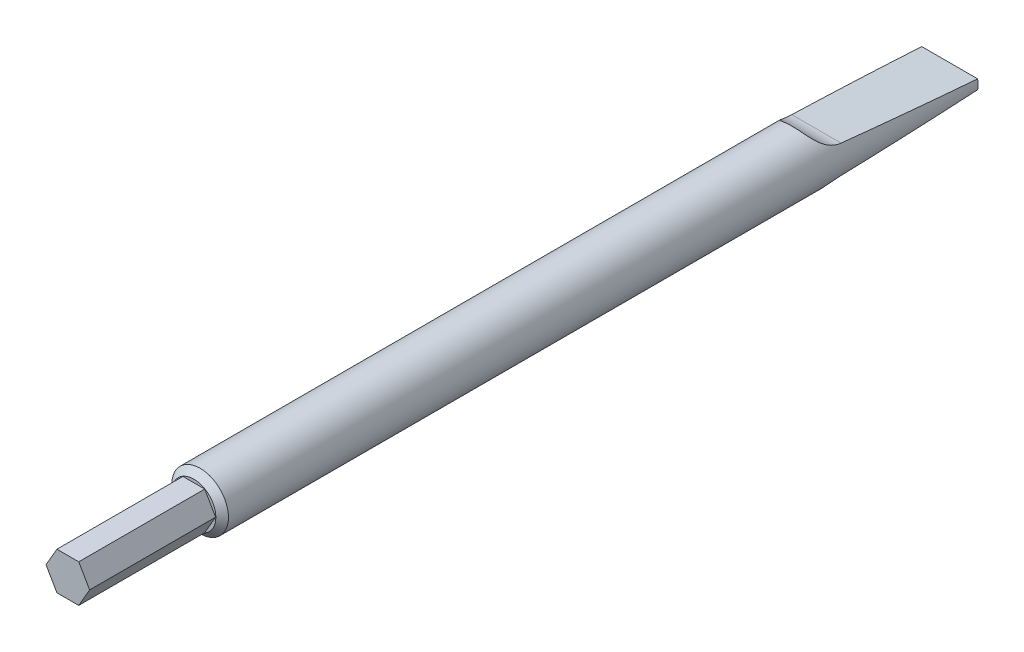
ISO-10303-21;
HEADER;
FILE_DESCRIPTION(('STEP AP214'),'2;1');
FILE_NAME('part.step','',(''),(''),'','','');
FILE_SCHEMA(('AUTOMOTIVE_DESIGN { 1 0 10303 214 1 1 1 1 }'));
ENDSEC;
DATA;
#1=APPLICATION_CONTEXT('core data for automotive mechanical design processes');
#2=APPLICATION_PROTOCOL_DEFINITION('international standard','automotive_design',2000,#1);
#3=PRODUCT_CONTEXT('',#1,'mechanical');
#4=PRODUCT('Part','Part','',(#3));
#5=PRODUCT_RELATED_PRODUCT_CATEGORY('part','',(#4));
#6=PRODUCT_DEFINITION_FORMATION('','',#4);
#7=PRODUCT_DEFINITION_CONTEXT('part definition',#1,'design');
#8=PRODUCT_DEFINITION('design','',#6,#7);
#9=PRODUCT_DEFINITION_SHAPE('','',#8);
#10=(LENGTH_UNIT() NAMED_UNIT(*) SI_UNIT(.MILLI.,.METRE.));
#11=(NAMED_UNIT(*) PLANE_ANGLE_UNIT() SI_UNIT($,.RADIAN.));
#12=(NAMED_UNIT(*) SI_UNIT($,.STERADIAN.) SOLID_ANGLE_UNIT());
#13=UNCERTAINTY_MEASURE_WITH_UNIT(LENGTH_MEASURE(1.E-05),#10,'distance_accuracy_value','');
#14=(GEOMETRIC_REPRESENTATION_CONTEXT(3) GLOBAL_UNCERTAINTY_ASSIGNED_CONTEXT((#13)) GLOBAL_UNIT_ASSIGNED_CONTEXT((#10,
#11,#12)) REPRESENTATION_CONTEXT('',''));
#15=CARTESIAN_POINT('',(0.,0.,0.));
#16=DIRECTION('',(0.,0.,1.));
#17=DIRECTION('',(1.,0.,0.));
#18=AXIS2_PLACEMENT_3D('',#15,#16,#17);
#19=CARTESIAN_POINT('',(0.,0.,140.));
#20=DIRECTION('',(0.,0.,-1.));
#21=DIRECTION('',(-1.,0.,0.));
#22=AXIS2_PLACEMENT_3D('',#19,#20,#21);
#23=CYLINDRICAL_SURFACE('',#22,4.5);
#24=CARTESIAN_POINT('',(0.,0.,119.));
#25=DIRECTION('',(0.,0.,1.));
#26=DIRECTION('',(1.,0.,0.));
#27=AXIS2_PLACEMENT_3D('',#24,#25,#26);
#28=CIRCLE('',#27,4.5);
#29=CARTESIAN_POINT('',(4.5,0.,119.));
#30=VERTEX_POINT('',#29);
#31=EDGE_CURVE('E11',#30,#30,#28,.F.);
#32=ORIENTED_EDGE('',*,*,#31,.T.);
#33=EDGE_LOOP('',(#32));
#34=FACE_BOUND('',#33,.T.);
#35=CARTESIAN_POINT('',(0.,0.,-10.725499692535));
#36=DIRECTION('',(0.,0.997564050259825,0.0697564737441185));
#37=DIRECTION('',(0.,0.0697564737441185,-0.997564050259825));
#38=AXIS2_PLACEMENT_3D('',#35,#36,#37);
#39=ELLIPSE('',#38,64.5101416179228,4.5);
#40=CARTESIAN_POINT('',(-4.43705983732471,-0.75,0.));
#41=VERTEX_POINT('',#40);
#42=CARTESIAN_POINT('',(-3.90913794443017,-2.22904475760722,21.1513254572824));
#43=VERTEX_POINT('',#42);
#44=EDGE_CURVE('E69',#41,#43,#39,.T.);
#45=ORIENTED_EDGE('',*,*,#44,.T.);
#46=CARTESIAN_POINT('',(-3.90913794443017,-2.22904475760722,21.1513254572824));
#47=CARTESIAN_POINT('',(-3.90455301412377,-2.23702621646595,21.2657212132345));
#48=CARTESIAN_POINT('',(-3.89774124246862,-2.24897237830149,21.3797590828916));
#49=CARTESIAN_POINT('',(-3.87934716952951,-2.28058564520304,21.6064053250025));
#50=CARTESIAN_POINT('',(-3.86776339242712,-2.30025513874374,21.7190132441058));
#51=CARTESIAN_POINT('',(-3.83945395370806,-2.34719584400117,21.9424636901827));
#52=CARTESIAN_POINT('',(-3.82270774842761,-2.37449738593538,22.0532972684768));
#53=CARTESIAN_POINT('',(-3.78362142886629,-2.43629843668384,22.2719244707792));
#54=CARTESIAN_POINT('',(-3.76128183711767,-2.47079727307913,22.3797183777065));
#55=CARTESIAN_POINT('',(-3.71037687082047,-2.54660406210736,22.591783439092));
#56=CARTESIAN_POINT('',(-3.68179205909025,-2.58793317273795,22.6960423943975));
#57=CARTESIAN_POINT('',(-3.61783051026301,-2.67661907337451,22.8998054883973));
#58=CARTESIAN_POINT('',(-3.58245433848774,-2.7239753615598,22.9993100219954));
#59=CARTESIAN_POINT('',(-3.50439309765495,-2.82369022401106,23.1924807424696));
#60=CARTESIAN_POINT('',(-3.46172484722619,-2.87603716753386,23.2861597022053));
#61=CARTESIAN_POINT('',(-3.36849906138698,-2.98468304106417,23.4670817573417));
#62=CARTESIAN_POINT('',(-3.31794236581198,-3.04098155002157,23.5543255364029));
#63=CARTESIAN_POINT('',(-3.21235166899272,-3.15218326142469,23.7158408456823));
#64=CARTESIAN_POINT('',(-3.15786937601247,-3.20691354791835,23.7905922592952));
#65=CARTESIAN_POINT('',(-3.0416166206618,-3.31737747759312,23.9333806491692));
#66=CARTESIAN_POINT('',(-2.97984690966123,-3.37311101683252,24.0014183163256));
#67=CARTESIAN_POINT('',(-2.84907936053117,-3.48426592602745,24.1304491566601));
#68=CARTESIAN_POINT('',(-2.78008114230154,-3.53968727940553,24.1914419590397));
#69=CARTESIAN_POINT('',(-2.63513370421153,-3.64887642748698,24.3062174045127));
#70=CARTESIAN_POINT('',(-2.55918489021555,-3.70264431849593,24.3600004681511));
#71=CARTESIAN_POINT('',(-2.40814230508494,-3.80240311983265,24.4557307551175));
#72=CARTESIAN_POINT('',(-2.333620251596,-3.84865318926917,24.4983127509193));
#73=CARTESIAN_POINT('',(-2.17966921272721,-3.93788764806109,24.5777088430627));
#74=CARTESIAN_POINT('',(-2.10023867309248,-3.98087099331306,24.6145210992529));
#75=CARTESIAN_POINT('',(-1.93704749879935,-4.0627799418261,24.6825667235048));
#76=CARTESIAN_POINT('',(-1.8532879114825,-4.10170651974427,24.7138014328905));
#77=CARTESIAN_POINT('',(-1.68196842738305,-4.17488472425586,24.770982842735));
#78=CARTESIAN_POINT('',(-1.59440708697687,-4.20913455413962,24.7969275127476));
#79=CARTESIAN_POINT('',(-1.41506271783802,-4.27279286567592,24.8440808938705));
#80=CARTESIAN_POINT('',(-1.32324199674038,-4.30213927068598,24.8652299379405));
#81=CARTESIAN_POINT('',(-1.13696065361359,-4.35507754079022,24.9026924606927));
#82=CARTESIAN_POINT('',(-1.04249914270463,-4.37866744162886,24.9190042892099));
#83=CARTESIAN_POINT('',(-0.851591587608839,-4.4197653908091,24.9470398014366));
#84=CARTESIAN_POINT('',(-0.755145476548869,-4.43727323385286,24.9587633302712));
#85=CARTESIAN_POINT('',(-0.560890393805509,-4.4659873816768,24.9778238035592));
#86=CARTESIAN_POINT('',(-0.463081368735783,-4.47719343889634,24.9851605756831));
#87=CARTESIAN_POINT('',(-0.261310371063207,-4.49360841061999,24.9958683113205));
#88=CARTESIAN_POINT('',(-0.157305834671544,-4.49845362158802,24.998998986471));
#89=CARTESIAN_POINT('',(0.0507912499549119,-4.50091605877074,25.0005929964614));
#90=CARTESIAN_POINT('',(0.154883761930138,-4.49853547669683,24.9990577465592));
#91=CARTESIAN_POINT('',(0.362541163810423,-4.48657840402764,24.9912882474975));
#92=CARTESIAN_POINT('',(0.466105708581836,-4.47699769520909,24.9850512437901));
#93=CARTESIAN_POINT('',(0.671888596740895,-4.45076624447433,24.9677494437622));
#94=CARTESIAN_POINT('',(0.774107437996968,-4.43411819762721,24.9566864877332));
#95=CARTESIAN_POINT('',(0.978376392649262,-4.39361106688486,24.9292665375624));
#96=CARTESIAN_POINT('',(1.08038886357039,-4.36962505271903,24.9128159648378));
#97=CARTESIAN_POINT('',(1.28148931228222,-4.31493201627952,24.8743854893785));
#98=CARTESIAN_POINT('',(1.38057841172089,-4.28422761082079,24.8524077389842));
#99=CARTESIAN_POINT('',(1.57507265805738,-4.21660333411226,24.8025671697608));
#100=CARTESIAN_POINT('',(1.67047842467344,-4.17968451408553,24.7747053460718));
#101=CARTESIAN_POINT('',(1.85684260853615,-4.10029171346882,24.7127227603541));
#102=CARTESIAN_POINT('',(1.94780125029289,-4.05781801371186,24.6786023147016));
#103=CARTESIAN_POINT('',(2.1212610503141,-3.96980587526509,24.6051431929467));
#104=CARTESIAN_POINT('',(2.2039505416873,-3.92443872232141,24.5660439828018));
#105=CARTESIAN_POINT('',(2.36394116852966,-3.83019636416512,24.4814672628314));
#106=CARTESIAN_POINT('',(2.44124045890576,-3.78131996922832,24.4359875848287));
#107=CARTESIAN_POINT('',(2.58984633123177,-3.68113041341152,24.3385658148577));
#108=CARTESIAN_POINT('',(2.66115775490604,-3.62981927482607,24.2866290300058));
#109=CARTESIAN_POINT('',(2.79750455439799,-3.52580828649944,24.1762428419052));
#110=CARTESIAN_POINT('',(2.86253769658988,-3.4731079509501,24.1177911366598));
#111=CARTESIAN_POINT('',(2.98297651089298,-3.37013542649679,23.9976352116153));
#112=CARTESIAN_POINT('',(3.03870143596111,-3.31987400410266,23.9362410985309));
#113=CARTESIAN_POINT('',(3.14423550741773,-3.22010235349992,23.8079535768254));
#114=CARTESIAN_POINT('',(3.1940425506208,-3.17059239777904,23.7410582272999));
#115=CARTESIAN_POINT('',(3.28779056711403,-3.07327174497447,23.6021545560445));
#116=CARTESIAN_POINT('',(3.33173282550279,-3.02546067731879,23.5301473597434));
#117=CARTESIAN_POINT('',(3.41397726201648,-2.9323405462307,23.381409497246));
#118=CARTESIAN_POINT('',(3.45227737571845,-2.88703240237238,23.3046771166262));
#119=CARTESIAN_POINT('',(3.52457291290432,-2.7983491159169,23.1446227051581));
#120=CARTESIAN_POINT('',(3.5584044908135,-2.75507290609883,23.0611719734531));
#121=CARTESIAN_POINT('',(3.62074796646082,-2.67261260417679,22.8903106801841));
#122=CARTESIAN_POINT('',(3.64925750881828,-2.63343032729207,22.8028983865145));
#123=CARTESIAN_POINT('',(3.70134563535076,-2.55970296754414,22.6246702570626));
#124=CARTESIAN_POINT('',(3.72492197992578,-2.52515999339447,22.5338528973964));
#125=CARTESIAN_POINT('',(3.76751692246683,-2.46115721426337,22.3494021580068));
#126=CARTESIAN_POINT('',(3.78653544657556,-2.43169749165576,22.2557687326779));
#127=CARTESIAN_POINT('',(3.8180438137627,-2.38186601038416,22.0792585335936));
#128=CARTESIAN_POINT('',(3.83107165117273,-2.36080172872788,21.9966714755454));
#129=CARTESIAN_POINT('',(3.85419730016864,-2.32285508466944,21.8301420720193));
#130=CARTESIAN_POINT('',(3.86429528366974,-2.30597247690746,21.7461998063664));
#131=CARTESIAN_POINT('',(3.88170608285842,-2.27654460459313,21.5774915447712));
#132=CARTESIAN_POINT('',(3.88902574489362,-2.26398868533892,21.4927281085199));
#133=CARTESIAN_POINT('',(3.90102964912081,-2.24323185058356,21.3224859566252));
#134=CARTESIAN_POINT('',(3.90571394949787,-2.23503083893238,21.2370072568161));
#135=CARTESIAN_POINT('',(3.90913794443017,-2.22904475760722,21.1513254572824));
#136=B_SPLINE_CURVE_WITH_KNOTS('',3,(#46,#47,#48,#49,#50,#51,#52,#53,#54,#55,#56,#57,#58,#59,
#60,#61,#62,#63,#64,#65,#66,#67,#68,#69,#70,#71,#72,#73,#74,#75,#76,#77,#78,#79,#80,#81,#82,#83,
#84,#85,#86,#87,#88,#89,#90,#91,#92,#93,#94,#95,#96,#97,#98,#99,#100,#101,#102,#103,#104,#105,
#106,#107,#108,#109,#110,#111,#112,#113,#114,#115,#116,#117,#118,#119,#120,#121,#122,#123,#124,
#125,#126,#127,#128,#129,#130,#131,#132,#133,#134,#135),.UNSPECIFIED.,.F.,.F.,(4,2,2,2,2,2,2,2,
2,2,2,2,2,2,2,2,2,2,2,2,2,2,2,2,2,2,2,2,2,2,2,2,2,2,2,2,2,2,2,2,2,2,2,2,4),(0.,
0.344218673375678,0.688543881854533,1.03425740296902,1.37993863968717,1.72671147818457,
2.07345546336165,2.41941024420035,2.76532821840738,3.08731527466606,3.40926916138806,
3.73123998607431,4.05319202197887,4.34533978740268,4.63758053917161,4.92975091609524,
5.2220332249011,5.51777376437492,5.81361507685586,6.10946637439192,6.40532929339929,
6.71746313275992,7.02950230584374,7.34172443098359,7.6538275996825,7.97166795893542,
8.28938473897339,8.60704782832553,8.92469486407742,9.23060206706421,9.5366134747622,
9.8423750131276,10.1482449345384,10.4387759573694,10.7294099265602,11.0199801067688,
11.3106563419919,11.6100631974406,11.9096022492632,12.2092769938199,12.5089565941337,
12.7674602840366,13.0259488026339,13.2837961526945,13.5416378096241),.UNSPECIFIED.);
#137=CARTESIAN_POINT('',(3.90913794443017,-2.22904475760722,21.1513254572824));
#138=VERTEX_POINT('',#137);
#139=EDGE_CURVE('E208',#43,#138,#136,.T.);
#140=ORIENTED_EDGE('',*,*,#139,.T.);
#141=CARTESIAN_POINT('',(4.43705983732471,-0.75,0.));
#142=VERTEX_POINT('',#141);
#143=EDGE_CURVE('E188',#138,#142,#39,.T.);
#144=ORIENTED_EDGE('',*,*,#143,.T.);
#145=CARTESIAN_POINT('',(0.,0.,0.));
#146=DIRECTION('',(0.,0.,1.));
#147=DIRECTION('',(1.,0.,0.));
#148=AXIS2_PLACEMENT_3D('',#145,#146,#147);
#149=CIRCLE('',#148,4.5);
#150=CARTESIAN_POINT('',(4.43705983732471,0.75,0.));
#151=VERTEX_POINT('',#150);
#152=EDGE_CURVE('E191',#142,#151,#149,.T.);
#153=ORIENTED_EDGE('',*,*,#152,.T.);
#154=CARTESIAN_POINT('',(0.,0.,-10.725499692535));
#155=DIRECTION('',(0.,-0.997564050259825,0.0697564737441185));
#156=DIRECTION('',(0.,-0.0697564737441185,-0.997564050259825));
#157=AXIS2_PLACEMENT_3D('',#154,#155,#156);
#158=ELLIPSE('',#157,64.5101416179228,4.5);
#159=CARTESIAN_POINT('',(3.90913794443017,2.22904475760722,21.1513254572824));
#160=VERTEX_POINT('',#159);
#161=EDGE_CURVE('E187',#151,#160,#158,.T.);
#162=ORIENTED_EDGE('',*,*,#161,.T.);
#163=CARTESIAN_POINT('',(3.90913794443017,2.22904475760722,21.1513254572824));
#164=CARTESIAN_POINT('',(3.90455301412377,2.23702621646595,21.2657212132345));
#165=CARTESIAN_POINT('',(3.89774124246862,2.24897237830149,21.3797590828916));
#166=CARTESIAN_POINT('',(3.87934716952951,2.28058564520304,21.6064053250025));
#167=CARTESIAN_POINT('',(3.86776339242712,2.30025513874374,21.7190132441058));
#168=CARTESIAN_POINT('',(3.83945395370806,2.34719584400117,21.9424636901827));
#169=CARTESIAN_POINT('',(3.82270774842761,2.37449738593538,22.0532972684768));
#170=CARTESIAN_POINT('',(3.78362142886629,2.43629843668384,22.2719244707792));
#171=CARTESIAN_POINT('',(3.76128183711767,2.47079727307913,22.3797183777065));
#172=CARTESIAN_POINT('',(3.71037687082047,2.54660406210736,22.591783439092));
#173=CARTESIAN_POINT('',(3.68179205909025,2.58793317273795,22.6960423943975));
#174=CARTESIAN_POINT('',(3.61783051026301,2.67661907337451,22.8998054883973));
#175=CARTESIAN_POINT('',(3.58245433848774,2.7239753615598,22.9993100219954));
#176=CARTESIAN_POINT('',(3.50439309765495,2.82369022401106,23.1924807424696));
#177=CARTESIAN_POINT('',(3.46172484722619,2.87603716753386,23.2861597022053));
#178=CARTESIAN_POINT('',(3.36849906138698,2.98468304106417,23.4670817573417));
#179=CARTESIAN_POINT('',(3.31794236581198,3.04098155002157,23.5543255364029));
#180=CARTESIAN_POINT('',(3.21235166899272,3.15218326142469,23.7158408456823));
#181=CARTESIAN_POINT('',(3.15786937601247,3.20691354791835,23.7905922592952));
#182=CARTESIAN_POINT('',(3.0416166206618,3.31737747759312,23.9333806491692));
#183=CARTESIAN_POINT('',(2.97984690966123,3.37311101683252,24.0014183163256));
#184=CARTESIAN_POINT('',(2.84907936053117,3.48426592602745,24.1304491566601));
#185=CARTESIAN_POINT('',(2.78008114230154,3.53968727940553,24.1914419590397));
#186=CARTESIAN_POINT('',(2.63513370421153,3.64887642748698,24.3062174045127));
#187=CARTESIAN_POINT('',(2.55918489021555,3.70264431849593,24.3600004681511));
#188=CARTESIAN_POINT('',(2.40814230508494,3.80240311983265,24.4557307551175));
#189=CARTESIAN_POINT('',(2.333620251596,3.84865318926917,24.4983127509193));
#190=CARTESIAN_POINT('',(2.17966921272721,3.93788764806109,24.5777088430627));
#191=CARTESIAN_POINT('',(2.10023867309248,3.98087099331306,24.6145210992529));
#192=CARTESIAN_POINT('',(1.93704749879935,4.0627799418261,24.6825667235048));
#193=CARTESIAN_POINT('',(1.8532879114825,4.10170651974427,24.7138014328905));
#194=CARTESIAN_POINT('',(1.68196842738305,4.17488472425586,24.770982842735));
#195=CARTESIAN_POINT('',(1.59440708697687,4.20913455413962,24.7969275127476));
#196=CARTESIAN_POINT('',(1.41506271783802,4.27279286567592,24.8440808938705));
#197=CARTESIAN_POINT('',(1.32324199674038,4.30213927068598,24.8652299379405));
#198=CARTESIAN_POINT('',(1.13696065361359,4.35507754079022,24.9026924606927));
#199=CARTESIAN_POINT('',(1.04249914270463,4.37866744162886,24.9190042892099));
#200=CARTESIAN_POINT('',(0.851591587608839,4.4197653908091,24.9470398014366));
#201=CARTESIAN_POINT('',(0.755145476548869,4.43727323385286,24.9587633302712));
#202=CARTESIAN_POINT('',(0.560890393805509,4.4659873816768,24.9778238035592));
#203=CARTESIAN_POINT('',(0.463081368735783,4.47719343889634,24.9851605756831));
#204=CARTESIAN_POINT('',(0.261310371063207,4.49360841061999,24.9958683113205));
#205=CARTESIAN_POINT('',(0.157305834671544,4.49845362158802,24.998998986471));
#206=CARTESIAN_POINT('',(-0.0507912499549119,4.50091605877074,25.0005929964614));
#207=CARTESIAN_POINT('',(-0.154883761930138,4.49853547669683,24.9990577465592));
#208=CARTESIAN_POINT('',(-0.362541163810423,4.48657840402764,24.9912882474975));
#209=CARTESIAN_POINT('',(-0.466105708581836,4.47699769520909,24.9850512437901));
#210=CARTESIAN_POINT('',(-0.671888596740895,4.45076624447433,24.9677494437622));
#211=CARTESIAN_POINT('',(-0.774107437996968,4.43411819762721,24.9566864877332));
#212=CARTESIAN_POINT('',(-0.978376392649262,4.39361106688486,24.9292665375624));
#213=CARTESIAN_POINT('',(-1.08038886357039,4.36962505271903,24.9128159648378));
#214=CARTESIAN_POINT('',(-1.28148931228222,4.31493201627952,24.8743854893785));
#215=CARTESIAN_POINT('',(-1.38057841172089,4.28422761082079,24.8524077389842));
#216=CARTESIAN_POINT('',(-1.57507265805738,4.21660333411226,24.8025671697608));
#217=CARTESIAN_POINT('',(-1.67047842467344,4.17968451408553,24.7747053460718));
#218=CARTESIAN_POINT('',(-1.85684260853615,4.10029171346882,24.7127227603541));
#219=CARTESIAN_POINT('',(-1.94780125029289,4.05781801371186,24.6786023147016));
#220=CARTESIAN_POINT('',(-2.1212610503141,3.96980587526509,24.6051431929467));
#221=CARTESIAN_POINT('',(-2.2039505416873,3.92443872232141,24.5660439828018));
#222=CARTESIAN_POINT('',(-2.36394116852966,3.83019636416512,24.4814672628314));
#223=CARTESIAN_POINT('',(-2.44124045890576,3.78131996922832,24.4359875848287));
#224=CARTESIAN_POINT('',(-2.58984633123177,3.68113041341152,24.3385658148577));
#225=CARTESIAN_POINT('',(-2.66115775490604,3.62981927482607,24.2866290300058));
#226=CARTESIAN_POINT('',(-2.79750455439799,3.52580828649944,24.1762428419052));
#227=CARTESIAN_POINT('',(-2.86253769658988,3.4731079509501,24.1177911366598));
#228=CARTESIAN_POINT('',(-2.98297651089298,3.37013542649679,23.9976352116153));
#229=CARTESIAN_POINT('',(-3.03870143596111,3.31987400410266,23.9362410985309));
#230=CARTESIAN_POINT('',(-3.14423550741773,3.22010235349992,23.8079535768254));
#231=CARTESIAN_POINT('',(-3.1940425506208,3.17059239777904,23.7410582272999));
#232=CARTESIAN_POINT('',(-3.28779056711403,3.07327174497447,23.6021545560445));
#233=CARTESIAN_POINT('',(-3.33173282550279,3.02546067731879,23.5301473597434));
#234=CARTESIAN_POINT('',(-3.41397726201648,2.9323405462307,23.381409497246));
#235=CARTESIAN_POINT('',(-3.45227737571845,2.88703240237238,23.3046771166262));
#236=CARTESIAN_POINT('',(-3.52457291290432,2.7983491159169,23.1446227051581));
#237=CARTESIAN_POINT('',(-3.5584044908135,2.75507290609883,23.0611719734531));
#238=CARTESIAN_POINT('',(-3.62074796646082,2.67261260417679,22.8903106801841));
#239=CARTESIAN_POINT('',(-3.64925750881828,2.63343032729207,22.8028983865145));
#240=CARTESIAN_POINT('',(-3.70134563535076,2.55970296754414,22.6246702570626));
#241=CARTESIAN_POINT('',(-3.72492197992578,2.52515999339447,22.5338528973964));
#242=CARTESIAN_POINT('',(-3.76751692246683,2.46115721426337,22.3494021580068));
#243=CARTESIAN_POINT('',(-3.78653544657556,2.43169749165576,22.2557687326779));
#244=CARTESIAN_POINT('',(-3.8180438137627,2.38186601038416,22.0792585335936));
#245=CARTESIAN_POINT('',(-3.83107165117273,2.36080172872788,21.9966714755454));
#246=CARTESIAN_POINT('',(-3.85419730016864,2.32285508466944,21.8301420720193));
#247=CARTESIAN_POINT('',(-3.86429528366974,2.30597247690746,21.7461998063664));
#248=CARTESIAN_POINT('',(-3.88170608285842,2.27654460459313,21.5774915447712));
#249=CARTESIAN_POINT('',(-3.88902574489362,2.26398868533892,21.4927281085199));
#250=CARTESIAN_POINT('',(-3.90102964912081,2.24323185058356,21.3224859566252));
#251=CARTESIAN_POINT('',(-3.90571394949787,2.23503083893238,21.2370072568161));
#252=CARTESIAN_POINT('',(-3.90913794443017,2.22904475760722,21.1513254572824));
#253=B_SPLINE_CURVE_WITH_KNOTS('',3,(#163,#164,#165,#166,#167,#168,#169,#170,#171,#172,#173,
#174,#175,#176,#177,#178,#179,#180,#181,#182,#183,#184,#185,#186,#187,#188,#189,#190,#191,#192,
#193,#194,#195,#196,#197,#198,#199,#200,#201,#202,#203,#204,#205,#206,#207,#208,#209,#210,#211,
#212,#213,#214,#215,#216,#217,#218,#219,#220,#221,#222,#223,#224,#225,#226,#227,#228,#229,#230,
#231,#232,#233,#234,#235,#236,#237,#238,#239,#240,#241,#242,#243,#244,#245,#246,#247,#248,#249,
#250,#251,#252),.UNSPECIFIED.,.F.,.F.,(4,2,2,2,2,2,2,2,2,2,2,2,2,2,2,2,2,2,2,2,2,2,2,2,2,2,2,2,
2,2,2,2,2,2,2,2,2,2,2,2,2,2,2,2,4),(0.,0.344218673375678,0.688543881854533,1.03425740296902,
1.37993863968717,1.72671147818457,2.07345546336165,2.41941024420035,2.76532821840738,
3.08731527466606,3.40926916138806,3.73123998607431,4.05319202197887,4.34533978740268,
4.63758053917161,4.92975091609524,5.2220332249011,5.51777376437492,5.81361507685586,
6.10946637439192,6.40532929339929,6.71746313275992,7.02950230584374,7.34172443098359,
7.6538275996825,7.97166795893542,8.28938473897339,8.60704782832553,8.92469486407742,
9.23060206706421,9.5366134747622,9.8423750131276,10.1482449345384,10.4387759573694,
10.7294099265602,11.0199801067688,11.3106563419919,11.6100631974406,11.9096022492632,
12.2092769938199,12.5089565941337,12.7674602840366,13.0259488026339,13.2837961526945,
13.5416378096241),.UNSPECIFIED.);
#254=CARTESIAN_POINT('',(-3.90913794443017,2.22904475760722,21.1513254572824));
#255=VERTEX_POINT('',#254);
#256=EDGE_CURVE('E200',#160,#255,#253,.T.);
#257=ORIENTED_EDGE('',*,*,#256,.T.);
#258=CARTESIAN_POINT('',(-4.43705983732471,0.75,0.));
#259=VERTEX_POINT('',#258);
#260=EDGE_CURVE('E182',#255,#259,#158,.T.);
#261=ORIENTED_EDGE('',*,*,#260,.T.);
#262=EDGE_CURVE('E194',#259,#41,#149,.T.);
#263=ORIENTED_EDGE('',*,*,#262,.T.);
#264=EDGE_LOOP('',(#45,#140,#144,#153,#162,#257,#261,#263));
#265=FACE_BOUND('',#264,.T.);
#266=ADVANCED_FACE('F45',(#34,#265),#23,.T.);
#267=CARTESIAN_POINT('',(0.,0.,0.));
#268=DIRECTION('',(0.,0.,1.));
#269=DIRECTION('',(1.,0.,0.));
#270=AXIS2_PLACEMENT_3D('',#267,#268,#269);
#271=PLANE('',#270);
#272=ORIENTED_EDGE('',*,*,#152,.F.);
#273=DIRECTION('',(-1.,0.,0.));
#274=VECTOR('',#273,1.);
#275=CARTESIAN_POINT('',(0.,-0.75,0.));
#276=LINE('',#275,#274);
#277=EDGE_CURVE('E198',#142,#41,#276,.T.);
#278=ORIENTED_EDGE('',*,*,#277,.T.);
#279=ORIENTED_EDGE('',*,*,#262,.F.);
#280=DIRECTION('',(1.,0.,0.));
#281=VECTOR('',#280,1.);
#282=CARTESIAN_POINT('',(0.,0.75,0.));
#283=LINE('',#282,#281);
#284=EDGE_CURVE('E195',#259,#151,#283,.T.);
#285=ORIENTED_EDGE('',*,*,#284,.T.);
#286=EDGE_LOOP('',(#272,#278,#279,#285));
#287=FACE_BOUND('',#286,.T.);
#288=ADVANCED_FACE('F221',(#287),#271,.F.);
#289=CARTESIAN_POINT('',(-4.5,7.21686500890635,20.8025430885618));
#290=DIRECTION('',(1.,0.,0.));
#291=DIRECTION('',(0.,0.,-1.));
#292=AXIS2_PLACEMENT_3D('',#289,#290,#291);
#293=CYLINDRICAL_SURFACE('',#292,5.);
#294=DIRECTION('',(1.,0.,0.));
#295=VECTOR('',#294,1.);
#296=CARTESIAN_POINT('',(-4.5,2.22904475760722,21.1513254572824));
#297=LINE('',#296,#295);
#298=EDGE_CURVE('E144',#255,#160,#297,.T.);
#299=ORIENTED_EDGE('',*,*,#298,.F.);
#300=ORIENTED_EDGE('',*,*,#256,.F.);
#301=EDGE_LOOP('',(#299,#300));
#302=FACE_BOUND('',#301,.T.);
#303=ADVANCED_FACE('F216',(#302),#293,.F.);
#304=CARTESIAN_POINT('',(-4.5,2.22904475760722,21.1513254572824));
#305=DIRECTION('',(0.,-0.997564050259825,0.0697564737441185));
#306=DIRECTION('',(0.,-0.0697564737441185,-0.997564050259825));
#307=AXIS2_PLACEMENT_3D('',#304,#305,#306);
#308=PLANE('',#307);
#309=ORIENTED_EDGE('',*,*,#284,.F.);
#310=ORIENTED_EDGE('',*,*,#260,.F.);
#311=ORIENTED_EDGE('',*,*,#298,.T.);
#312=ORIENTED_EDGE('',*,*,#161,.F.);
#313=EDGE_LOOP('',(#309,#310,#311,#312));
#314=FACE_BOUND('',#313,.T.);
#315=ADVANCED_FACE('F220',(#314),#308,.F.);
#316=CARTESIAN_POINT('',(-4.5,-7.21686500890635,20.8025430885618));
#317=DIRECTION('',(1.,0.,0.));
#318=DIRECTION('',(0.,0.,-1.));
#319=AXIS2_PLACEMENT_3D('',#316,#317,#318);
#320=CYLINDRICAL_SURFACE('',#319,5.);
#321=DIRECTION('',(1.,0.,0.));
#322=VECTOR('',#321,1.);
#323=CARTESIAN_POINT('',(-4.5,-2.22904475760722,21.1513254572824));
#324=LINE('',#323,#322);
#325=EDGE_CURVE('E179',#43,#138,#324,.T.);
#326=ORIENTED_EDGE('',*,*,#325,.T.);
#327=ORIENTED_EDGE('',*,*,#139,.F.);
#328=EDGE_LOOP('',(#326,#327));
#329=FACE_BOUND('',#328,.T.);
#330=ADVANCED_FACE('F223',(#329),#320,.F.);
#331=CARTESIAN_POINT('',(-4.5,-2.22904475760722,21.1513254572824));
#332=DIRECTION('',(0.,0.997564050259825,0.0697564737441185));
#333=DIRECTION('',(0.,-0.0697564737441185,0.997564050259825));
#334=AXIS2_PLACEMENT_3D('',#331,#332,#333);
#335=PLANE('',#334);
#336=ORIENTED_EDGE('',*,*,#277,.F.);
#337=ORIENTED_EDGE('',*,*,#143,.F.);
#338=ORIENTED_EDGE('',*,*,#325,.F.);
#339=ORIENTED_EDGE('',*,*,#44,.F.);
#340=EDGE_LOOP('',(#336,#337,#338,#339));
#341=FACE_BOUND('',#340,.T.);
#342=ADVANCED_FACE('F245',(#341),#335,.F.);
#343=CARTESIAN_POINT('',(0.,0.,120.));
#344=DIRECTION('',(0.,0.,1.));
#345=DIRECTION('',(1.,0.,0.));
#346=AXIS2_PLACEMENT_3D('',#343,#344,#345);
#347=PLANE('',#346);
#348=CARTESIAN_POINT('',(0.,0.,120.));
#349=DIRECTION('',(0.,0.,1.));
#350=DIRECTION('',(1.,0.,0.));
#351=AXIS2_PLACEMENT_3D('',#348,#349,#350);
#352=CIRCLE('',#351,3.5);
#353=CARTESIAN_POINT('',(3.5,0.,120.));
#354=VERTEX_POINT('',#353);
#355=EDGE_CURVE('E54',#354,#354,#352,.T.);
#356=ORIENTED_EDGE('',*,*,#355,.T.);
#357=EDGE_LOOP('',(#356));
#358=FACE_BOUND('',#357,.T.);
#359=DIRECTION('',(1.,0.,0.));
#360=VECTOR('',#359,1.);
#361=CARTESIAN_POINT('',(0.,3.,120.));
#362=LINE('',#361,#360);
#363=CARTESIAN_POINT('',(-1.73205080756889,2.99999999999999,120.));
#364=VERTEX_POINT('',#363);
#365=CARTESIAN_POINT('',(1.73205080756887,3.00000000000001,120.));
#366=VERTEX_POINT('',#365);
#367=EDGE_CURVE('E123',#364,#366,#362,.T.);
#368=ORIENTED_EDGE('',*,*,#367,.T.);
#369=DIRECTION('',(0.500000000000003,-0.866025403784437,0.));
#370=VECTOR('',#369,1.);
#371=CARTESIAN_POINT('',(2.59807621135331,1.50000000000001,120.));
#372=LINE('',#371,#370);
#373=CARTESIAN_POINT('',(3.46410161513776,0.,120.));
#374=VERTEX_POINT('',#373);
#375=EDGE_CURVE('E127',#366,#374,#372,.T.);
#376=ORIENTED_EDGE('',*,*,#375,.T.);
#377=DIRECTION('',(-0.499999999999997,-0.866025403784441,0.));
#378=VECTOR('',#377,1.);
#379=CARTESIAN_POINT('',(2.59807621135332,-1.49999999999999,120.));
#380=LINE('',#379,#378);
#381=CARTESIAN_POINT('',(1.73205080756889,-3.,120.));
#382=VERTEX_POINT('',#381);
#383=EDGE_CURVE('E149',#374,#382,#380,.T.);
#384=ORIENTED_EDGE('',*,*,#383,.T.);
#385=DIRECTION('',(-1.,0.,0.));
#386=VECTOR('',#385,1.);
#387=CARTESIAN_POINT('',(0.,-3.,120.));
#388=LINE('',#387,#386);
#389=CARTESIAN_POINT('',(-1.73205080756887,-3.00000000000001,120.));
#390=VERTEX_POINT('',#389);
#391=EDGE_CURVE('E151',#382,#390,#388,.T.);
#392=ORIENTED_EDGE('',*,*,#391,.T.);
#393=DIRECTION('',(-0.500000000000003,0.866025403784437,0.));
#394=VECTOR('',#393,1.);
#395=CARTESIAN_POINT('',(-2.59807621135331,-1.50000000000001,120.));
#396=LINE('',#395,#394);
#397=CARTESIAN_POINT('',(-3.46410161513776,0.,120.));
#398=VERTEX_POINT('',#397);
#399=EDGE_CURVE('E155',#390,#398,#396,.T.);
#400=ORIENTED_EDGE('',*,*,#399,.T.);
#401=DIRECTION('',(0.499999999999997,0.86602540378444,0.));
#402=VECTOR('',#401,1.);
#403=CARTESIAN_POINT('',(-2.59807621135332,1.49999999999999,120.));
#404=LINE('',#403,#402);
#405=EDGE_CURVE('E131',#398,#364,#404,.T.);
#406=ORIENTED_EDGE('',*,*,#405,.T.);
#407=EDGE_LOOP('',(#368,#376,#384,#392,#400,#406));
#408=FACE_BOUND('',#407,.T.);
#409=ADVANCED_FACE('F125',(#358,#408),#347,.T.);
#410=CARTESIAN_POINT('',(0.,3.,120.));
#411=DIRECTION('',(0.,-1.,0.));
#412=DIRECTION('',(1.,0.,0.));
#413=AXIS2_PLACEMENT_3D('',#410,#411,#412);
#414=PLANE('',#413);
#415=DIRECTION('',(1.,0.,0.));
#416=VECTOR('',#415,1.);
#417=CARTESIAN_POINT('',(0.,3.,140.));
#418=LINE('',#417,#416);
#419=CARTESIAN_POINT('',(-1.73205080756889,2.99999999999999,140.));
#420=VERTEX_POINT('',#419);
#421=CARTESIAN_POINT('',(1.73205080756887,3.00000000000001,140.));
#422=VERTEX_POINT('',#421);
#423=EDGE_CURVE('E140',#420,#422,#418,.T.);
#424=ORIENTED_EDGE('',*,*,#423,.T.);
#425=DIRECTION('',(0.,0.,1.));
#426=VECTOR('',#425,1.);
#427=CARTESIAN_POINT('',(1.73205080756887,3.00000000000001,120.));
#428=LINE('',#427,#426);
#429=EDGE_CURVE('E137',#366,#422,#428,.T.);
#430=ORIENTED_EDGE('',*,*,#429,.F.);
#431=ORIENTED_EDGE('',*,*,#367,.F.);
#432=DIRECTION('',(0.,0.,1.));
#433=VECTOR('',#432,1.);
#434=CARTESIAN_POINT('',(-1.73205080756889,2.99999999999999,120.));
#435=LINE('',#434,#433);
#436=EDGE_CURVE('E158',#364,#420,#435,.T.);
#437=ORIENTED_EDGE('',*,*,#436,.T.);
#438=EDGE_LOOP('',(#424,#430,#431,#437));
#439=FACE_BOUND('',#438,.T.);
#440=ADVANCED_FACE('F138',(#439),#414,.F.);
#441=CARTESIAN_POINT('',(2.59807621135331,1.50000000000001,120.));
#442=DIRECTION('',(-0.866025403784437,-0.500000000000003,0.));
#443=DIRECTION('',(0.500000000000003,-0.866025403784437,0.));
#444=AXIS2_PLACEMENT_3D('',#441,#442,#443);
#445=PLANE('',#444);
#446=DIRECTION('',(0.500000000000003,-0.866025403784437,0.));
#447=VECTOR('',#446,1.);
#448=CARTESIAN_POINT('',(2.59807621135331,1.50000000000001,140.));
#449=LINE('',#448,#447);
#450=CARTESIAN_POINT('',(3.46410161513776,0.,140.));
#451=VERTEX_POINT('',#450);
#452=EDGE_CURVE('E160',#422,#451,#449,.T.);
#453=ORIENTED_EDGE('',*,*,#452,.T.);
#454=DIRECTION('',(0.,0.,1.));
#455=VECTOR('',#454,1.);
#456=CARTESIAN_POINT('',(3.46410161513776,0.,120.));
#457=LINE('',#456,#455);
#458=EDGE_CURVE('E145',#374,#451,#457,.T.);
#459=ORIENTED_EDGE('',*,*,#458,.F.);
#460=ORIENTED_EDGE('',*,*,#375,.F.);
#461=ORIENTED_EDGE('',*,*,#429,.T.);
#462=EDGE_LOOP('',(#453,#459,#460,#461));
#463=FACE_BOUND('',#462,.T.);
#464=ADVANCED_FACE('F147',(#463),#445,.F.);
#465=CARTESIAN_POINT('',(2.59807621135332,-1.49999999999999,120.));
#466=DIRECTION('',(-0.86602540378444,0.499999999999997,0.));
#467=DIRECTION('',(-0.499999999999997,-0.86602540378444,0.));
#468=AXIS2_PLACEMENT_3D('',#465,#466,#467);
#469=PLANE('',#468);
#470=DIRECTION('',(-0.499999999999997,-0.866025403784441,0.));
#471=VECTOR('',#470,1.);
#472=CARTESIAN_POINT('',(2.59807621135332,-1.49999999999999,140.));
#473=LINE('',#472,#471);
#474=CARTESIAN_POINT('',(1.73205080756889,-3.,140.));
#475=VERTEX_POINT('',#474);
#476=EDGE_CURVE('E162',#451,#475,#473,.T.);
#477=ORIENTED_EDGE('',*,*,#476,.T.);
#478=DIRECTION('',(0.,0.,1.));
#479=VECTOR('',#478,1.);
#480=CARTESIAN_POINT('',(1.73205080756889,-3.,120.));
#481=LINE('',#480,#479);
#482=EDGE_CURVE('E176',#382,#475,#481,.T.);
#483=ORIENTED_EDGE('',*,*,#482,.F.);
#484=ORIENTED_EDGE('',*,*,#383,.F.);
#485=ORIENTED_EDGE('',*,*,#458,.T.);
#486=EDGE_LOOP('',(#477,#483,#484,#485));
#487=FACE_BOUND('',#486,.T.);
#488=ADVANCED_FACE('F298',(#487),#469,.F.);
#489=CARTESIAN_POINT('',(0.,-3.,120.));
#490=DIRECTION('',(0.,1.,0.));
#491=DIRECTION('',(-1.,0.,0.));
#492=AXIS2_PLACEMENT_3D('',#489,#490,#491);
#493=PLANE('',#492);
#494=DIRECTION('',(-1.,0.,0.));
#495=VECTOR('',#494,1.);
#496=CARTESIAN_POINT('',(0.,-3.,140.));
#497=LINE('',#496,#495);
#498=CARTESIAN_POINT('',(-1.73205080756887,-3.00000000000001,140.));
#499=VERTEX_POINT('',#498);
#500=EDGE_CURVE('E165',#475,#499,#497,.T.);
#501=ORIENTED_EDGE('',*,*,#500,.T.);
#502=DIRECTION('',(0.,0.,1.));
#503=VECTOR('',#502,1.);
#504=CARTESIAN_POINT('',(-1.73205080756887,-3.00000000000001,120.));
#505=LINE('',#504,#503);
#506=EDGE_CURVE('E174',#390,#499,#505,.T.);
#507=ORIENTED_EDGE('',*,*,#506,.F.);
#508=ORIENTED_EDGE('',*,*,#391,.F.);
#509=ORIENTED_EDGE('',*,*,#482,.T.);
#510=EDGE_LOOP('',(#501,#507,#508,#509));
#511=FACE_BOUND('',#510,.T.);
#512=ADVANCED_FACE('F290',(#511),#493,.F.);
#513=CARTESIAN_POINT('',(-2.59807621135331,-1.50000000000001,120.));
#514=DIRECTION('',(0.866025403784437,0.500000000000003,0.));
#515=DIRECTION('',(-0.500000000000003,0.866025403784437,0.));
#516=AXIS2_PLACEMENT_3D('',#513,#514,#515);
#517=PLANE('',#516);
#518=DIRECTION('',(-0.500000000000003,0.866025403784437,0.));
#519=VECTOR('',#518,1.);
#520=CARTESIAN_POINT('',(-2.59807621135331,-1.50000000000001,140.));
#521=LINE('',#520,#519);
#522=CARTESIAN_POINT('',(-3.46410161513776,0.,140.));
#523=VERTEX_POINT('',#522);
#524=EDGE_CURVE('E61',#499,#523,#521,.T.);
#525=ORIENTED_EDGE('',*,*,#524,.T.);
#526=DIRECTION('',(0.,0.,1.));
#527=VECTOR('',#526,1.);
#528=CARTESIAN_POINT('',(-3.46410161513776,0.,120.));
#529=LINE('',#528,#527);
#530=EDGE_CURVE('E172',#398,#523,#529,.T.);
#531=ORIENTED_EDGE('',*,*,#530,.F.);
#532=ORIENTED_EDGE('',*,*,#399,.F.);
#533=ORIENTED_EDGE('',*,*,#506,.T.);
#534=EDGE_LOOP('',(#525,#531,#532,#533));
#535=FACE_BOUND('',#534,.T.);
#536=ADVANCED_FACE('F281',(#535),#517,.F.);
#537=CARTESIAN_POINT('',(-2.59807621135332,1.49999999999999,120.));
#538=DIRECTION('',(0.86602540378444,-0.499999999999997,0.));
#539=DIRECTION('',(0.499999999999997,0.86602540378444,0.));
#540=AXIS2_PLACEMENT_3D('',#537,#538,#539);
#541=PLANE('',#540);
#542=DIRECTION('',(0.499999999999997,0.86602540378444,0.));
#543=VECTOR('',#542,1.);
#544=CARTESIAN_POINT('',(-2.59807621135332,1.49999999999999,140.));
#545=LINE('',#544,#543);
#546=EDGE_CURVE('E134',#523,#420,#545,.T.);
#547=ORIENTED_EDGE('',*,*,#546,.T.);
#548=ORIENTED_EDGE('',*,*,#436,.F.);
#549=ORIENTED_EDGE('',*,*,#405,.F.);
#550=ORIENTED_EDGE('',*,*,#530,.T.);
#551=EDGE_LOOP('',(#547,#548,#549,#550));
#552=FACE_BOUND('',#551,.T.);
#553=ADVANCED_FACE('F231',(#552),#541,.F.);
#554=CARTESIAN_POINT('',(0.,0.,140.));
#555=DIRECTION('',(0.,0.,1.));
#556=DIRECTION('',(1.,0.,0.));
#557=AXIS2_PLACEMENT_3D('',#554,#555,#556);
#558=PLANE('',#557);
#559=ORIENTED_EDGE('',*,*,#423,.F.);
#560=ORIENTED_EDGE('',*,*,#546,.F.);
#561=ORIENTED_EDGE('',*,*,#524,.F.);
#562=ORIENTED_EDGE('',*,*,#500,.F.);
#563=ORIENTED_EDGE('',*,*,#476,.F.);
#564=ORIENTED_EDGE('',*,*,#452,.F.);
#565=EDGE_LOOP('',(#559,#560,#561,#562,#563,#564));
#566=FACE_BOUND('',#565,.T.);
#567=ADVANCED_FACE('F229',(#566),#558,.T.);
#568=CARTESIAN_POINT('',(0.,0.,120.));
#569=DIRECTION('',(0.,0.,-1.));
#570=DIRECTION('',(-1.,0.,0.));
#571=AXIS2_PLACEMENT_3D('',#568,#569,#570);
#572=CONICAL_SURFACE('',#571,3.5,0.785398163397439);
#573=ORIENTED_EDGE('',*,*,#31,.F.);
#574=EDGE_LOOP('',(#573));
#575=FACE_BOUND('',#574,.T.);
#576=ORIENTED_EDGE('',*,*,#355,.F.);
#577=EDGE_LOOP('',(#576));
#578=FACE_BOUND('',#577,.T.);
#579=ADVANCED_FACE('F48',(#575,#578),#572,.T.);
#580=CLOSED_SHELL('',(#266,#288,#303,#315,#330,#342,#409,#440,#464,#488,#512,#536,#553,#567,#579));
#581=MANIFOLD_SOLID_BREP('B2',#580);
#582=ADVANCED_BREP_SHAPE_REPRESENTATION('',(#18,#581),#14);
#583=SHAPE_DEFINITION_REPRESENTATION(#9,#582);
ENDSEC;
END-ISO-10303-21;
